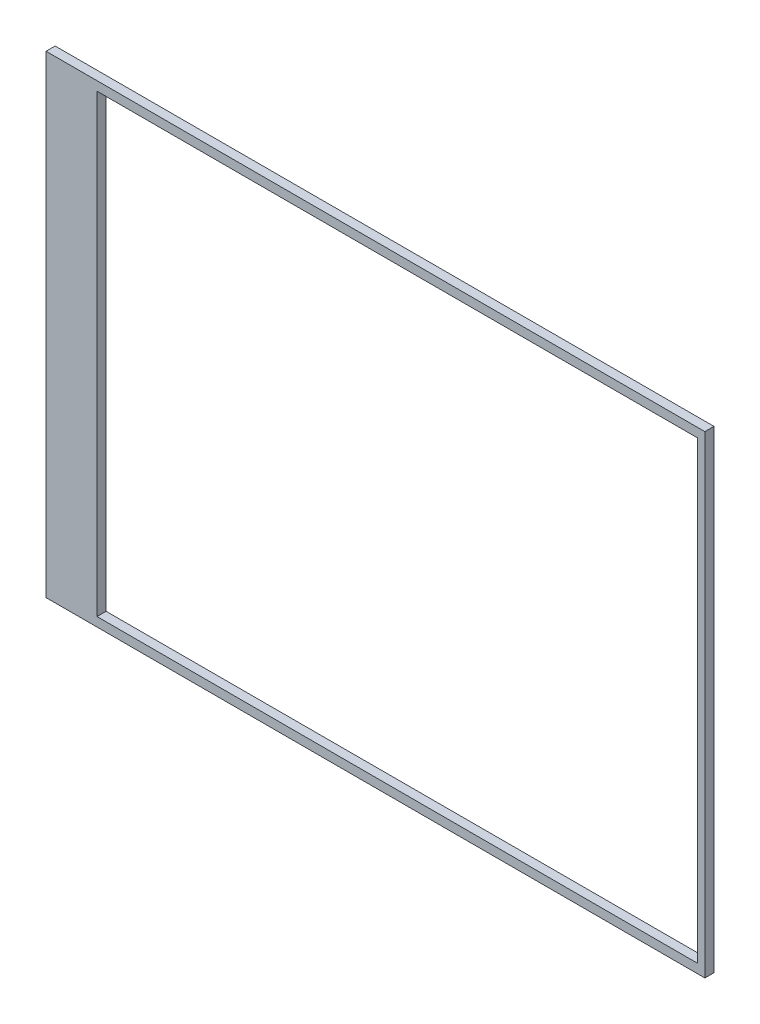
ISO-10303-21;
HEADER;
FILE_DESCRIPTION(('STEP AP214'),'2;1');
FILE_NAME('part.step','',(''),(''),'','','');
FILE_SCHEMA(('AUTOMOTIVE_DESIGN { 1 0 10303 214 1 1 1 1 }'));
ENDSEC;
DATA;
#1=APPLICATION_CONTEXT('core data for automotive mechanical design processes');
#2=APPLICATION_PROTOCOL_DEFINITION('international standard','automotive_design',2000,#1);
#3=PRODUCT_CONTEXT('',#1,'mechanical');
#4=PRODUCT('Part','Part','',(#3));
#5=PRODUCT_RELATED_PRODUCT_CATEGORY('part','',(#4));
#6=PRODUCT_DEFINITION_FORMATION('','',#4);
#7=PRODUCT_DEFINITION_CONTEXT('part definition',#1,'design');
#8=PRODUCT_DEFINITION('design','',#6,#7);
#9=PRODUCT_DEFINITION_SHAPE('','',#8);
#10=(LENGTH_UNIT() NAMED_UNIT(*) SI_UNIT(.MILLI.,.METRE.));
#11=(NAMED_UNIT(*) PLANE_ANGLE_UNIT() SI_UNIT($,.RADIAN.));
#12=(NAMED_UNIT(*) SI_UNIT($,.STERADIAN.) SOLID_ANGLE_UNIT());
#13=UNCERTAINTY_MEASURE_WITH_UNIT(LENGTH_MEASURE(1.E-05),#10,'distance_accuracy_value','');
#14=(GEOMETRIC_REPRESENTATION_CONTEXT(3) GLOBAL_UNCERTAINTY_ASSIGNED_CONTEXT((#13)) GLOBAL_UNIT_ASSIGNED_CONTEXT((#10,
#11,#12)) REPRESENTATION_CONTEXT('',''));
#15=CARTESIAN_POINT('',(0.,0.,0.));
#16=DIRECTION('',(0.,0.,1.));
#17=DIRECTION('',(1.,0.,0.));
#18=AXIS2_PLACEMENT_3D('',#15,#16,#17);
#19=CARTESIAN_POINT('',(0.,0.,1.));
#20=DIRECTION('',(0.,0.,1.));
#21=DIRECTION('',(1.,0.,0.));
#22=AXIS2_PLACEMENT_3D('',#19,#20,#21);
#23=PLANE('',#22);
#24=DIRECTION('',(0.,-1.,0.));
#25=VECTOR('',#24,1.);
#26=CARTESIAN_POINT('',(-39.7166335481995,11.2234042553191,1.));
#27=LINE('',#26,#25);
#28=CARTESIAN_POINT('',(-39.7166335481995,11.2234042553191,1.));
#29=VERTEX_POINT('',#28);
#30=CARTESIAN_POINT('',(-39.7166335481995,-40.7765957446809,1.));
#31=VERTEX_POINT('',#30);
#32=EDGE_CURVE('E157',#29,#31,#27,.T.);
#33=ORIENTED_EDGE('',*,*,#32,.T.);
#34=DIRECTION('',(1.,0.,0.));
#35=VECTOR('',#34,1.);
#36=CARTESIAN_POINT('',(-39.7166335481995,-40.7765957446809,1.));
#37=LINE('',#36,#35);
#38=CARTESIAN_POINT('',(32.6833664518005,-40.7765957446809,1.));
#39=VERTEX_POINT('',#38);
#40=EDGE_CURVE('E161',#31,#39,#37,.T.);
#41=ORIENTED_EDGE('',*,*,#40,.T.);
#42=DIRECTION('',(0.,1.,0.));
#43=VECTOR('',#42,1.);
#44=CARTESIAN_POINT('',(32.6833664518005,11.2234042553191,1.));
#45=LINE('',#44,#43);
#46=CARTESIAN_POINT('',(32.6833664518005,11.2234042553191,1.));
#47=VERTEX_POINT('',#46);
#48=EDGE_CURVE('E165',#39,#47,#45,.T.);
#49=ORIENTED_EDGE('',*,*,#48,.T.);
#50=DIRECTION('',(-1.,0.,0.));
#51=VECTOR('',#50,1.);
#52=CARTESIAN_POINT('',(-39.7166335481995,11.2234042553191,1.));
#53=LINE('',#52,#51);
#54=EDGE_CURVE('E168',#47,#29,#53,.T.);
#55=ORIENTED_EDGE('',*,*,#54,.T.);
#56=EDGE_LOOP('',(#33,#41,#49,#55));
#57=FACE_BOUND('',#56,.T.);
#58=DIRECTION('',(1.,0.,0.));
#59=VECTOR('',#58,1.);
#60=CARTESIAN_POINT('',(-34.1166335481995,-39.7765957446809,1.));
#61=LINE('',#60,#59);
#62=CARTESIAN_POINT('',(-34.1166335481995,-39.7765957446809,1.));
#63=VERTEX_POINT('',#62);
#64=CARTESIAN_POINT('',(31.8833664518005,-39.7765957446809,1.));
#65=VERTEX_POINT('',#64);
#66=EDGE_CURVE('E118',#63,#65,#61,.T.);
#67=ORIENTED_EDGE('',*,*,#66,.F.);
#68=DIRECTION('',(0.,-1.,0.));
#69=VECTOR('',#68,1.);
#70=CARTESIAN_POINT('',(-34.1166335481995,10.2234042553191,1.));
#71=LINE('',#70,#69);
#72=CARTESIAN_POINT('',(-34.1166335481995,10.2234042553191,1.));
#73=VERTEX_POINT('',#72);
#74=EDGE_CURVE('E109',#73,#63,#71,.T.);
#75=ORIENTED_EDGE('',*,*,#74,.F.);
#76=DIRECTION('',(-1.,0.,0.));
#77=VECTOR('',#76,1.);
#78=CARTESIAN_POINT('',(-34.1166335481995,10.2234042553191,1.));
#79=LINE('',#78,#77);
#80=CARTESIAN_POINT('',(31.8833664518005,10.2234042553191,1.));
#81=VERTEX_POINT('',#80);
#82=EDGE_CURVE('E135',#81,#73,#79,.T.);
#83=ORIENTED_EDGE('',*,*,#82,.F.);
#84=DIRECTION('',(0.,1.,0.));
#85=VECTOR('',#84,1.);
#86=CARTESIAN_POINT('',(31.8833664518005,10.2234042553191,1.));
#87=LINE('',#86,#85);
#88=EDGE_CURVE('E131',#65,#81,#87,.T.);
#89=ORIENTED_EDGE('',*,*,#88,.F.);
#90=EDGE_LOOP('',(#67,#75,#83,#89));
#91=FACE_BOUND('',#90,.T.);
#92=ADVANCED_FACE('F43',(#57,#91),#23,.T.);
#93=CARTESIAN_POINT('',(0.,0.,0.));
#94=DIRECTION('',(0.,0.,1.));
#95=DIRECTION('',(1.,0.,0.));
#96=AXIS2_PLACEMENT_3D('',#93,#94,#95);
#97=PLANE('',#96);
#98=DIRECTION('',(0.,-1.,0.));
#99=VECTOR('',#98,1.);
#100=CARTESIAN_POINT('',(-39.7166335481995,11.2234042553191,0.));
#101=LINE('',#100,#99);
#102=CARTESIAN_POINT('',(-39.7166335481995,11.2234042553191,0.));
#103=VERTEX_POINT('',#102);
#104=CARTESIAN_POINT('',(-39.7166335481995,-40.7765957446809,0.));
#105=VERTEX_POINT('',#104);
#106=EDGE_CURVE('E127',#103,#105,#101,.T.);
#107=ORIENTED_EDGE('',*,*,#106,.F.);
#108=DIRECTION('',(-1.,0.,0.));
#109=VECTOR('',#108,1.);
#110=CARTESIAN_POINT('',(-39.7166335481995,11.2234042553191,0.));
#111=LINE('',#110,#109);
#112=CARTESIAN_POINT('',(32.6833664518005,11.2234042553191,0.));
#113=VERTEX_POINT('',#112);
#114=EDGE_CURVE('E162',#113,#103,#111,.T.);
#115=ORIENTED_EDGE('',*,*,#114,.F.);
#116=DIRECTION('',(0.,1.,0.));
#117=VECTOR('',#116,1.);
#118=CARTESIAN_POINT('',(32.6833664518005,11.2234042553191,0.));
#119=LINE('',#118,#117);
#120=CARTESIAN_POINT('',(32.6833664518005,-40.7765957446809,0.));
#121=VERTEX_POINT('',#120);
#122=EDGE_CURVE('E178',#121,#113,#119,.T.);
#123=ORIENTED_EDGE('',*,*,#122,.F.);
#124=DIRECTION('',(1.,0.,0.));
#125=VECTOR('',#124,1.);
#126=CARTESIAN_POINT('',(-39.7166335481995,-40.7765957446809,0.));
#127=LINE('',#126,#125);
#128=EDGE_CURVE('E175',#105,#121,#127,.T.);
#129=ORIENTED_EDGE('',*,*,#128,.F.);
#130=EDGE_LOOP('',(#107,#115,#123,#129));
#131=FACE_BOUND('',#130,.T.);
#132=DIRECTION('',(0.,-1.,0.));
#133=VECTOR('',#132,1.);
#134=CARTESIAN_POINT('',(-34.1166335481995,10.2234042553191,0.));
#135=LINE('',#134,#133);
#136=CARTESIAN_POINT('',(-34.1166335481995,10.2234042553191,0.));
#137=VERTEX_POINT('',#136);
#138=CARTESIAN_POINT('',(-34.1166335481995,-39.7765957446809,0.));
#139=VERTEX_POINT('',#138);
#140=EDGE_CURVE('E67',#137,#139,#135,.T.);
#141=ORIENTED_EDGE('',*,*,#140,.T.);
#142=DIRECTION('',(1.,0.,0.));
#143=VECTOR('',#142,1.);
#144=CARTESIAN_POINT('',(-34.1166335481995,-39.7765957446809,0.));
#145=LINE('',#144,#143);
#146=CARTESIAN_POINT('',(31.8833664518005,-39.7765957446809,0.));
#147=VERTEX_POINT('',#146);
#148=EDGE_CURVE('E125',#139,#147,#145,.T.);
#149=ORIENTED_EDGE('',*,*,#148,.T.);
#150=DIRECTION('',(0.,1.,0.));
#151=VECTOR('',#150,1.);
#152=CARTESIAN_POINT('',(31.8833664518005,10.2234042553191,0.));
#153=LINE('',#152,#151);
#154=CARTESIAN_POINT('',(31.8833664518005,10.2234042553191,0.));
#155=VERTEX_POINT('',#154);
#156=EDGE_CURVE('E144',#147,#155,#153,.T.);
#157=ORIENTED_EDGE('',*,*,#156,.T.);
#158=DIRECTION('',(-1.,0.,0.));
#159=VECTOR('',#158,1.);
#160=CARTESIAN_POINT('',(-34.1166335481995,10.2234042553191,0.));
#161=LINE('',#160,#159);
#162=EDGE_CURVE('E119',#155,#137,#161,.T.);
#163=ORIENTED_EDGE('',*,*,#162,.T.);
#164=EDGE_LOOP('',(#141,#149,#157,#163));
#165=FACE_BOUND('',#164,.T.);
#166=ADVANCED_FACE('F201',(#131,#165),#97,.F.);
#167=CARTESIAN_POINT('',(-39.7166335481995,11.2234042553191,1.));
#168=DIRECTION('',(1.,0.,0.));
#169=DIRECTION('',(0.,1.,0.));
#170=AXIS2_PLACEMENT_3D('',#167,#168,#169);
#171=PLANE('',#170);
#172=ORIENTED_EDGE('',*,*,#106,.T.);
#173=DIRECTION('',(0.,0.,-1.));
#174=VECTOR('',#173,1.);
#175=CARTESIAN_POINT('',(-39.7166335481995,-40.7765957446809,1.));
#176=LINE('',#175,#174);
#177=EDGE_CURVE('E11',#31,#105,#176,.T.);
#178=ORIENTED_EDGE('',*,*,#177,.F.);
#179=ORIENTED_EDGE('',*,*,#32,.F.);
#180=DIRECTION('',(0.,0.,-1.));
#181=VECTOR('',#180,1.);
#182=CARTESIAN_POINT('',(-39.7166335481995,11.2234042553191,1.));
#183=LINE('',#182,#181);
#184=EDGE_CURVE('E171',#29,#103,#183,.T.);
#185=ORIENTED_EDGE('',*,*,#184,.T.);
#186=EDGE_LOOP('',(#172,#178,#179,#185));
#187=FACE_BOUND('',#186,.T.);
#188=ADVANCED_FACE('F45',(#187),#171,.F.);
#189=CARTESIAN_POINT('',(-39.7166335481995,-40.7765957446809,1.));
#190=DIRECTION('',(0.,1.,0.));
#191=DIRECTION('',(0.,0.,1.));
#192=AXIS2_PLACEMENT_3D('',#189,#190,#191);
#193=PLANE('',#192);
#194=ORIENTED_EDGE('',*,*,#128,.T.);
#195=DIRECTION('',(0.,0.,-1.));
#196=VECTOR('',#195,1.);
#197=CARTESIAN_POINT('',(32.6833664518005,-40.7765957446809,1.));
#198=LINE('',#197,#196);
#199=EDGE_CURVE('E52',#39,#121,#198,.T.);
#200=ORIENTED_EDGE('',*,*,#199,.F.);
#201=ORIENTED_EDGE('',*,*,#40,.F.);
#202=ORIENTED_EDGE('',*,*,#177,.T.);
#203=EDGE_LOOP('',(#194,#200,#201,#202));
#204=FACE_BOUND('',#203,.T.);
#205=ADVANCED_FACE('F211',(#204),#193,.F.);
#206=CARTESIAN_POINT('',(32.6833664518005,11.2234042553191,1.));
#207=DIRECTION('',(-1.,0.,0.));
#208=DIRECTION('',(0.,-1.,0.));
#209=AXIS2_PLACEMENT_3D('',#206,#207,#208);
#210=PLANE('',#209);
#211=ORIENTED_EDGE('',*,*,#122,.T.);
#212=DIRECTION('',(0.,0.,-1.));
#213=VECTOR('',#212,1.);
#214=CARTESIAN_POINT('',(32.6833664518005,11.2234042553191,1.));
#215=LINE('',#214,#213);
#216=EDGE_CURVE('E186',#47,#113,#215,.T.);
#217=ORIENTED_EDGE('',*,*,#216,.F.);
#218=ORIENTED_EDGE('',*,*,#48,.F.);
#219=ORIENTED_EDGE('',*,*,#199,.T.);
#220=EDGE_LOOP('',(#211,#217,#218,#219));
#221=FACE_BOUND('',#220,.T.);
#222=ADVANCED_FACE('F195',(#221),#210,.F.);
#223=CARTESIAN_POINT('',(-39.7166335481995,11.2234042553191,1.));
#224=DIRECTION('',(0.,-1.,0.));
#225=DIRECTION('',(0.,0.,-1.));
#226=AXIS2_PLACEMENT_3D('',#223,#224,#225);
#227=PLANE('',#226);
#228=ORIENTED_EDGE('',*,*,#114,.T.);
#229=ORIENTED_EDGE('',*,*,#184,.F.);
#230=ORIENTED_EDGE('',*,*,#54,.F.);
#231=ORIENTED_EDGE('',*,*,#216,.T.);
#232=EDGE_LOOP('',(#228,#229,#230,#231));
#233=FACE_BOUND('',#232,.T.);
#234=ADVANCED_FACE('F205',(#233),#227,.F.);
#235=CARTESIAN_POINT('',(-34.1166335481995,10.2234042553191,1.));
#236=DIRECTION('',(1.,0.,0.));
#237=DIRECTION('',(0.,1.,0.));
#238=AXIS2_PLACEMENT_3D('',#235,#236,#237);
#239=PLANE('',#238);
#240=ORIENTED_EDGE('',*,*,#140,.F.);
#241=DIRECTION('',(0.,0.,-1.));
#242=VECTOR('',#241,1.);
#243=CARTESIAN_POINT('',(-34.1166335481995,10.2234042553191,1.));
#244=LINE('',#243,#242);
#245=EDGE_CURVE('E113',#73,#137,#244,.T.);
#246=ORIENTED_EDGE('',*,*,#245,.F.);
#247=ORIENTED_EDGE('',*,*,#74,.T.);
#248=DIRECTION('',(0.,0.,-1.));
#249=VECTOR('',#248,1.);
#250=CARTESIAN_POINT('',(-34.1166335481995,-39.7765957446809,1.));
#251=LINE('',#250,#249);
#252=EDGE_CURVE('E112',#63,#139,#251,.T.);
#253=ORIENTED_EDGE('',*,*,#252,.T.);
#254=EDGE_LOOP('',(#240,#246,#247,#253));
#255=FACE_BOUND('',#254,.T.);
#256=ADVANCED_FACE('F111',(#255),#239,.T.);
#257=CARTESIAN_POINT('',(-34.1166335481995,-39.7765957446809,1.));
#258=DIRECTION('',(0.,1.,0.));
#259=DIRECTION('',(0.,0.,1.));
#260=AXIS2_PLACEMENT_3D('',#257,#258,#259);
#261=PLANE('',#260);
#262=ORIENTED_EDGE('',*,*,#148,.F.);
#263=ORIENTED_EDGE('',*,*,#252,.F.);
#264=ORIENTED_EDGE('',*,*,#66,.T.);
#265=DIRECTION('',(0.,0.,-1.));
#266=VECTOR('',#265,1.);
#267=CARTESIAN_POINT('',(31.8833664518005,-39.7765957446809,1.));
#268=LINE('',#267,#266);
#269=EDGE_CURVE('E128',#65,#147,#268,.T.);
#270=ORIENTED_EDGE('',*,*,#269,.T.);
#271=EDGE_LOOP('',(#262,#263,#264,#270));
#272=FACE_BOUND('',#271,.T.);
#273=ADVANCED_FACE('F122',(#272),#261,.T.);
#274=CARTESIAN_POINT('',(31.8833664518005,10.2234042553191,1.));
#275=DIRECTION('',(-1.,0.,0.));
#276=DIRECTION('',(0.,0.,1.));
#277=AXIS2_PLACEMENT_3D('',#274,#275,#276);
#278=PLANE('',#277);
#279=ORIENTED_EDGE('',*,*,#156,.F.);
#280=ORIENTED_EDGE('',*,*,#269,.F.);
#281=ORIENTED_EDGE('',*,*,#88,.T.);
#282=DIRECTION('',(0.,0.,-1.));
#283=VECTOR('',#282,1.);
#284=CARTESIAN_POINT('',(31.8833664518005,10.2234042553191,1.));
#285=LINE('',#284,#283);
#286=EDGE_CURVE('E59',#81,#155,#285,.T.);
#287=ORIENTED_EDGE('',*,*,#286,.T.);
#288=EDGE_LOOP('',(#279,#280,#281,#287));
#289=FACE_BOUND('',#288,.T.);
#290=ADVANCED_FACE('F234',(#289),#278,.T.);
#291=CARTESIAN_POINT('',(-34.1166335481995,10.2234042553191,1.));
#292=DIRECTION('',(0.,-1.,0.));
#293=DIRECTION('',(1.,0.,0.));
#294=AXIS2_PLACEMENT_3D('',#291,#292,#293);
#295=PLANE('',#294);
#296=ORIENTED_EDGE('',*,*,#162,.F.);
#297=ORIENTED_EDGE('',*,*,#286,.F.);
#298=ORIENTED_EDGE('',*,*,#82,.T.);
#299=ORIENTED_EDGE('',*,*,#245,.T.);
#300=EDGE_LOOP('',(#296,#297,#298,#299));
#301=FACE_BOUND('',#300,.T.);
#302=ADVANCED_FACE('F238',(#301),#295,.T.);
#303=CLOSED_SHELL('',(#92,#166,#188,#205,#222,#234,#256,#273,#290,#302));
#304=MANIFOLD_SOLID_BREP('B2',#303);
#305=ADVANCED_BREP_SHAPE_REPRESENTATION('',(#18,#304),#14);
#306=SHAPE_DEFINITION_REPRESENTATION(#9,#305);
ENDSEC;
END-ISO-10303-21;
